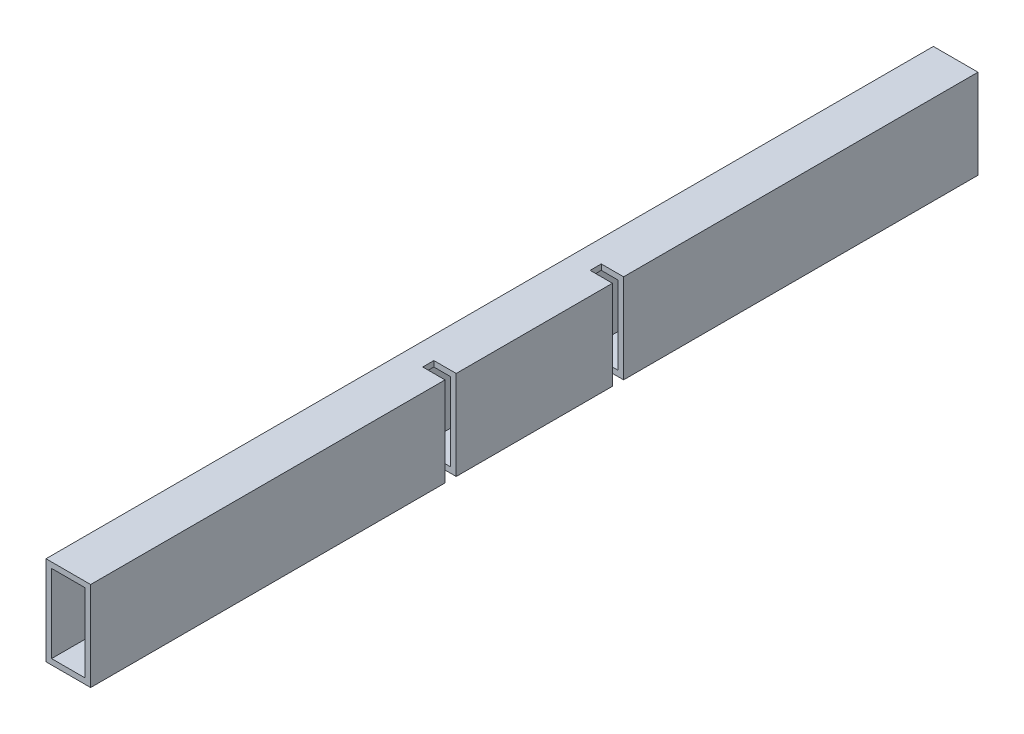
ISO-10303-21;
HEADER;
FILE_DESCRIPTION(('STEP AP214'),'2;1');
FILE_NAME('part.step','',(''),(''),'','','');
FILE_SCHEMA(('AUTOMOTIVE_DESIGN { 1 0 10303 214 1 1 1 1 }'));
ENDSEC;
DATA;
#1=APPLICATION_CONTEXT('core data for automotive mechanical design processes');
#2=APPLICATION_PROTOCOL_DEFINITION('international standard','automotive_design',2000,#1);
#3=PRODUCT_CONTEXT('',#1,'mechanical');
#4=PRODUCT('Part','Part','',(#3));
#5=PRODUCT_RELATED_PRODUCT_CATEGORY('part','',(#4));
#6=PRODUCT_DEFINITION_FORMATION('','',#4);
#7=PRODUCT_DEFINITION_CONTEXT('part definition',#1,'design');
#8=PRODUCT_DEFINITION('design','',#6,#7);
#9=PRODUCT_DEFINITION_SHAPE('','',#8);
#10=(LENGTH_UNIT() NAMED_UNIT(*) SI_UNIT(.MILLI.,.METRE.));
#11=(NAMED_UNIT(*) PLANE_ANGLE_UNIT() SI_UNIT($,.RADIAN.));
#12=(NAMED_UNIT(*) SI_UNIT($,.STERADIAN.) SOLID_ANGLE_UNIT());
#13=UNCERTAINTY_MEASURE_WITH_UNIT(LENGTH_MEASURE(1.E-05),#10,'distance_accuracy_value','');
#14=(GEOMETRIC_REPRESENTATION_CONTEXT(3) GLOBAL_UNCERTAINTY_ASSIGNED_CONTEXT((#13)) GLOBAL_UNIT_ASSIGNED_CONTEXT((#10,
#11,#12)) REPRESENTATION_CONTEXT('',''));
#15=CARTESIAN_POINT('',(0.,0.,0.));
#16=DIRECTION('',(0.,0.,1.));
#17=DIRECTION('',(1.,0.,0.));
#18=AXIS2_PLACEMENT_3D('',#15,#16,#17);
#19=CARTESIAN_POINT('',(12.7,25.4,252.476));
#20=DIRECTION('',(-1.,0.,0.));
#21=DIRECTION('',(0.,-1.,0.));
#22=AXIS2_PLACEMENT_3D('',#19,#20,#21);
#23=PLANE('',#22);
#24=DIRECTION('',(0.,0.,-1.));
#25=VECTOR('',#24,1.);
#26=CARTESIAN_POINT('',(12.7,-25.4,252.476));
#27=LINE('',#26,#25);
#28=CARTESIAN_POINT('',(12.7,-25.4,252.476));
#29=VERTEX_POINT('',#28);
#30=CARTESIAN_POINT('',(12.7,-25.4,50.8));
#31=VERTEX_POINT('',#30);
#32=EDGE_CURVE('E330',#29,#31,#27,.T.);
#33=ORIENTED_EDGE('',*,*,#32,.T.);
#34=DIRECTION('',(0.,-1.,0.));
#35=VECTOR('',#34,1.);
#36=CARTESIAN_POINT('',(12.7,-25.4,50.8));
#37=LINE('',#36,#35);
#38=CARTESIAN_POINT('',(12.7,25.4,50.8));
#39=VERTEX_POINT('',#38);
#40=EDGE_CURVE('E405',#39,#31,#37,.T.);
#41=ORIENTED_EDGE('',*,*,#40,.F.);
#42=DIRECTION('',(0.,0.,-1.));
#43=VECTOR('',#42,1.);
#44=CARTESIAN_POINT('',(12.7,25.4,252.476));
#45=LINE('',#44,#43);
#46=CARTESIAN_POINT('',(12.7,25.4,252.476));
#47=VERTEX_POINT('',#46);
#48=EDGE_CURVE('E340',#47,#39,#45,.T.);
#49=ORIENTED_EDGE('',*,*,#48,.F.);
#50=DIRECTION('',(0.,1.,0.));
#51=VECTOR('',#50,1.);
#52=CARTESIAN_POINT('',(12.7,25.4,252.476));
#53=LINE('',#52,#51);
#54=EDGE_CURVE('E311',#29,#47,#53,.T.);
#55=ORIENTED_EDGE('',*,*,#54,.F.);
#56=EDGE_LOOP('',(#33,#41,#49,#55));
#57=FACE_BOUND('',#56,.T.);
#58=ADVANCED_FACE('F33',(#57),#23,.F.);
#59=CARTESIAN_POINT('',(9.525,22.225,252.476));
#60=DIRECTION('',(-1.,0.,0.));
#61=DIRECTION('',(0.,-1.,0.));
#62=AXIS2_PLACEMENT_3D('',#59,#60,#61);
#63=PLANE('',#62);
#64=DIRECTION('',(0.,1.,0.));
#65=VECTOR('',#64,1.);
#66=CARTESIAN_POINT('',(9.525,22.2250000000001,50.8));
#67=LINE('',#66,#65);
#68=CARTESIAN_POINT('',(9.52500000000001,-22.225,50.7999999999999));
#69=VERTEX_POINT('',#68);
#70=CARTESIAN_POINT('',(9.525,22.225,50.8));
#71=VERTEX_POINT('',#70);
#72=EDGE_CURVE('E229',#69,#71,#67,.T.);
#73=ORIENTED_EDGE('',*,*,#72,.F.);
#74=DIRECTION('',(0.,0.,-1.));
#75=VECTOR('',#74,1.);
#76=CARTESIAN_POINT('',(9.52500000000001,-22.225,252.476));
#77=LINE('',#76,#75);
#78=CARTESIAN_POINT('',(9.52500000000001,-22.225,252.476));
#79=VERTEX_POINT('',#78);
#80=EDGE_CURVE('E303',#79,#69,#77,.T.);
#81=ORIENTED_EDGE('',*,*,#80,.F.);
#82=DIRECTION('',(0.,1.,0.));
#83=VECTOR('',#82,1.);
#84=CARTESIAN_POINT('',(9.525,22.225,252.476));
#85=LINE('',#84,#83);
#86=CARTESIAN_POINT('',(9.525,22.225,252.476));
#87=VERTEX_POINT('',#86);
#88=EDGE_CURVE('E279',#79,#87,#85,.T.);
#89=ORIENTED_EDGE('',*,*,#88,.T.);
#90=DIRECTION('',(0.,0.,-1.));
#91=VECTOR('',#90,1.);
#92=CARTESIAN_POINT('',(9.525,22.225,252.476));
#93=LINE('',#92,#91);
#94=EDGE_CURVE('E298',#87,#71,#93,.T.);
#95=ORIENTED_EDGE('',*,*,#94,.T.);
#96=EDGE_LOOP('',(#73,#81,#89,#95));
#97=FACE_BOUND('',#96,.T.);
#98=ADVANCED_FACE('F394',(#97),#63,.T.);
#99=CARTESIAN_POINT('',(12.7,25.4,-50.8));
#100=VERTEX_POINT('',#99);
#101=CARTESIAN_POINT('',(12.7,25.4,-252.476));
#102=VERTEX_POINT('',#101);
#103=EDGE_CURVE('E339',#100,#102,#45,.T.);
#104=ORIENTED_EDGE('',*,*,#103,.F.);
#105=DIRECTION('',(0.,1.,0.));
#106=VECTOR('',#105,1.);
#107=CARTESIAN_POINT('',(12.7,-25.4,-50.8));
#108=LINE('',#107,#106);
#109=CARTESIAN_POINT('',(12.7,-25.4,-50.8));
#110=VERTEX_POINT('',#109);
#111=EDGE_CURVE('E238',#110,#100,#108,.T.);
#112=ORIENTED_EDGE('',*,*,#111,.F.);
#113=CARTESIAN_POINT('',(12.7,-25.4,-252.476));
#114=VERTEX_POINT('',#113);
#115=EDGE_CURVE('E321',#110,#114,#27,.T.);
#116=ORIENTED_EDGE('',*,*,#115,.T.);
#117=DIRECTION('',(0.,1.,0.));
#118=VECTOR('',#117,1.);
#119=CARTESIAN_POINT('',(12.7,25.4,-252.476));
#120=LINE('',#119,#118);
#121=EDGE_CURVE('E310',#114,#102,#120,.T.);
#122=ORIENTED_EDGE('',*,*,#121,.T.);
#123=EDGE_LOOP('',(#104,#112,#116,#122));
#124=FACE_BOUND('',#123,.T.);
#125=ADVANCED_FACE('F426',(#124),#23,.F.);
#126=DIRECTION('',(0.,-1.,0.));
#127=VECTOR('',#126,1.);
#128=CARTESIAN_POINT('',(9.525,22.225,-50.8));
#129=LINE('',#128,#127);
#130=CARTESIAN_POINT('',(9.525,22.225,-50.8));
#131=VERTEX_POINT('',#130);
#132=CARTESIAN_POINT('',(9.52500000000001,-22.225,-50.8));
#133=VERTEX_POINT('',#132);
#134=EDGE_CURVE('E269',#131,#133,#129,.T.);
#135=ORIENTED_EDGE('',*,*,#134,.F.);
#136=CARTESIAN_POINT('',(9.525,22.225,-252.476));
#137=VERTEX_POINT('',#136);
#138=EDGE_CURVE('E297',#131,#137,#93,.T.);
#139=ORIENTED_EDGE('',*,*,#138,.T.);
#140=DIRECTION('',(0.,1.,0.));
#141=VECTOR('',#140,1.);
#142=CARTESIAN_POINT('',(9.525,22.225,-252.476));
#143=LINE('',#142,#141);
#144=CARTESIAN_POINT('',(9.52500000000001,-22.225,-252.476));
#145=VERTEX_POINT('',#144);
#146=EDGE_CURVE('E290',#145,#137,#143,.T.);
#147=ORIENTED_EDGE('',*,*,#146,.F.);
#148=EDGE_CURVE('E301',#133,#145,#77,.T.);
#149=ORIENTED_EDGE('',*,*,#148,.F.);
#150=EDGE_LOOP('',(#135,#139,#147,#149));
#151=FACE_BOUND('',#150,.T.);
#152=ADVANCED_FACE('F372',(#151),#63,.T.);
#153=CARTESIAN_POINT('',(0.,0.,252.476));
#154=DIRECTION('',(0.,0.,1.));
#155=DIRECTION('',(1.,0.,0.));
#156=AXIS2_PLACEMENT_3D('',#153,#154,#155);
#157=PLANE('',#156);
#158=ORIENTED_EDGE('',*,*,#54,.T.);
#159=DIRECTION('',(-1.,0.,0.));
#160=VECTOR('',#159,1.);
#161=CARTESIAN_POINT('',(-12.7,25.4,252.476));
#162=LINE('',#161,#160);
#163=CARTESIAN_POINT('',(-12.7,25.4,252.476));
#164=VERTEX_POINT('',#163);
#165=EDGE_CURVE('E314',#47,#164,#162,.T.);
#166=ORIENTED_EDGE('',*,*,#165,.T.);
#167=DIRECTION('',(0.,-1.,0.));
#168=VECTOR('',#167,1.);
#169=CARTESIAN_POINT('',(-12.7,25.4,252.476));
#170=LINE('',#169,#168);
#171=CARTESIAN_POINT('',(-12.7,-25.4,252.476));
#172=VERTEX_POINT('',#171);
#173=EDGE_CURVE('E317',#164,#172,#170,.T.);
#174=ORIENTED_EDGE('',*,*,#173,.T.);
#175=DIRECTION('',(1.,0.,0.));
#176=VECTOR('',#175,1.);
#177=CARTESIAN_POINT('',(-12.7,-25.4,252.476));
#178=LINE('',#177,#176);
#179=EDGE_CURVE('E319',#172,#29,#178,.T.);
#180=ORIENTED_EDGE('',*,*,#179,.T.);
#181=EDGE_LOOP('',(#158,#166,#174,#180));
#182=FACE_BOUND('',#181,.T.);
#183=DIRECTION('',(1.,0.,0.));
#184=VECTOR('',#183,1.);
#185=CARTESIAN_POINT('',(-9.525,-22.225,252.476));
#186=LINE('',#185,#184);
#187=CARTESIAN_POINT('',(-9.525,-22.225,252.476));
#188=VERTEX_POINT('',#187);
#189=EDGE_CURVE('E276',#188,#79,#186,.T.);
#190=ORIENTED_EDGE('',*,*,#189,.F.);
#191=DIRECTION('',(0.,-1.,0.));
#192=VECTOR('',#191,1.);
#193=CARTESIAN_POINT('',(-9.525,22.225,252.476));
#194=LINE('',#193,#192);
#195=CARTESIAN_POINT('',(-9.525,22.225,252.476));
#196=VERTEX_POINT('',#195);
#197=EDGE_CURVE('E274',#196,#188,#194,.T.);
#198=ORIENTED_EDGE('',*,*,#197,.F.);
#199=DIRECTION('',(-1.,0.,0.));
#200=VECTOR('',#199,1.);
#201=CARTESIAN_POINT('',(-9.525,22.225,252.476));
#202=LINE('',#201,#200);
#203=EDGE_CURVE('E282',#87,#196,#202,.T.);
#204=ORIENTED_EDGE('',*,*,#203,.F.);
#205=ORIENTED_EDGE('',*,*,#88,.F.);
#206=EDGE_LOOP('',(#190,#198,#204,#205));
#207=FACE_BOUND('',#206,.T.);
#208=ADVANCED_FACE('F389',(#182,#207),#157,.T.);
#209=CARTESIAN_POINT('',(0.,0.,-252.476));
#210=DIRECTION('',(0.,0.,1.));
#211=DIRECTION('',(1.,0.,0.));
#212=AXIS2_PLACEMENT_3D('',#209,#210,#211);
#213=PLANE('',#212);
#214=ORIENTED_EDGE('',*,*,#121,.F.);
#215=DIRECTION('',(1.,0.,0.));
#216=VECTOR('',#215,1.);
#217=CARTESIAN_POINT('',(-12.7,-25.4,-252.476));
#218=LINE('',#217,#216);
#219=CARTESIAN_POINT('',(-12.7,-25.4,-252.476));
#220=VERTEX_POINT('',#219);
#221=EDGE_CURVE('E315',#220,#114,#218,.T.);
#222=ORIENTED_EDGE('',*,*,#221,.F.);
#223=DIRECTION('',(0.,-1.,0.));
#224=VECTOR('',#223,1.);
#225=CARTESIAN_POINT('',(-12.7,25.4,-252.476));
#226=LINE('',#225,#224);
#227=CARTESIAN_POINT('',(-12.7,25.4,-252.476));
#228=VERTEX_POINT('',#227);
#229=EDGE_CURVE('E326',#228,#220,#226,.T.);
#230=ORIENTED_EDGE('',*,*,#229,.F.);
#231=DIRECTION('',(-1.,0.,0.));
#232=VECTOR('',#231,1.);
#233=CARTESIAN_POINT('',(-12.7,25.4,-252.476));
#234=LINE('',#233,#232);
#235=EDGE_CURVE('E324',#102,#228,#234,.T.);
#236=ORIENTED_EDGE('',*,*,#235,.F.);
#237=EDGE_LOOP('',(#214,#222,#230,#236));
#238=FACE_BOUND('',#237,.T.);
#239=DIRECTION('',(0.,-1.,0.));
#240=VECTOR('',#239,1.);
#241=CARTESIAN_POINT('',(-9.525,22.225,-252.476));
#242=LINE('',#241,#240);
#243=CARTESIAN_POINT('',(-9.525,22.225,-252.476));
#244=VERTEX_POINT('',#243);
#245=CARTESIAN_POINT('',(-9.525,-22.225,-252.476));
#246=VERTEX_POINT('',#245);
#247=EDGE_CURVE('E273',#244,#246,#242,.T.);
#248=ORIENTED_EDGE('',*,*,#247,.T.);
#249=DIRECTION('',(1.,0.,0.));
#250=VECTOR('',#249,1.);
#251=CARTESIAN_POINT('',(-9.525,-22.225,-252.476));
#252=LINE('',#251,#250);
#253=EDGE_CURVE('E287',#246,#145,#252,.T.);
#254=ORIENTED_EDGE('',*,*,#253,.T.);
#255=ORIENTED_EDGE('',*,*,#146,.T.);
#256=DIRECTION('',(-1.,0.,0.));
#257=VECTOR('',#256,1.);
#258=CARTESIAN_POINT('',(-9.525,22.225,-252.476));
#259=LINE('',#258,#257);
#260=EDGE_CURVE('E277',#137,#244,#259,.T.);
#261=ORIENTED_EDGE('',*,*,#260,.T.);
#262=EDGE_LOOP('',(#248,#254,#255,#261));
#263=FACE_BOUND('',#262,.T.);
#264=ADVANCED_FACE('F377',(#238,#263),#213,.F.);
#265=CARTESIAN_POINT('',(12.7,25.4,44.45));
#266=VERTEX_POINT('',#265);
#267=CARTESIAN_POINT('',(12.7,25.4,-44.45));
#268=VERTEX_POINT('',#267);
#269=EDGE_CURVE('E344',#266,#268,#45,.T.);
#270=ORIENTED_EDGE('',*,*,#269,.F.);
#271=DIRECTION('',(0.,1.,0.));
#272=VECTOR('',#271,1.);
#273=CARTESIAN_POINT('',(12.7,25.4,44.45));
#274=LINE('',#273,#272);
#275=CARTESIAN_POINT('',(12.7,-25.4,44.45));
#276=VERTEX_POINT('',#275);
#277=EDGE_CURVE('E399',#276,#266,#274,.T.);
#278=ORIENTED_EDGE('',*,*,#277,.F.);
#279=CARTESIAN_POINT('',(12.7,-25.4,-44.45));
#280=VERTEX_POINT('',#279);
#281=EDGE_CURVE('E215',#276,#280,#27,.T.);
#282=ORIENTED_EDGE('',*,*,#281,.T.);
#283=DIRECTION('',(0.,-1.,0.));
#284=VECTOR('',#283,1.);
#285=CARTESIAN_POINT('',(12.7,25.4,-44.45));
#286=LINE('',#285,#284);
#287=EDGE_CURVE('E233',#268,#280,#286,.T.);
#288=ORIENTED_EDGE('',*,*,#287,.F.);
#289=EDGE_LOOP('',(#270,#278,#282,#288));
#290=FACE_BOUND('',#289,.T.);
#291=ADVANCED_FACE('F35',(#290),#23,.F.);
#292=CARTESIAN_POINT('',(-12.7,25.4,252.476));
#293=DIRECTION('',(0.,-1.,0.));
#294=DIRECTION('',(0.,0.,-1.));
#295=AXIS2_PLACEMENT_3D('',#292,#293,#294);
#296=PLANE('',#295);
#297=ORIENTED_EDGE('',*,*,#48,.T.);
#298=DIRECTION('',(1.,0.,0.));
#299=VECTOR('',#298,1.);
#300=CARTESIAN_POINT('',(0.,25.4,50.8));
#301=LINE('',#300,#299);
#302=CARTESIAN_POINT('',(0.,25.4,50.8));
#303=VERTEX_POINT('',#302);
#304=EDGE_CURVE('E219',#303,#39,#301,.T.);
#305=ORIENTED_EDGE('',*,*,#304,.F.);
#306=DIRECTION('',(0.,0.,1.));
#307=VECTOR('',#306,1.);
#308=CARTESIAN_POINT('',(0.,25.4,50.8));
#309=LINE('',#308,#307);
#310=CARTESIAN_POINT('',(0.,25.4,44.45));
#311=VERTEX_POINT('',#310);
#312=EDGE_CURVE('E203',#311,#303,#309,.T.);
#313=ORIENTED_EDGE('',*,*,#312,.F.);
#314=DIRECTION('',(1.,0.,0.));
#315=VECTOR('',#314,1.);
#316=CARTESIAN_POINT('',(0.,25.4,44.45));
#317=LINE('',#316,#315);
#318=EDGE_CURVE('E216',#311,#266,#317,.T.);
#319=ORIENTED_EDGE('',*,*,#318,.T.);
#320=ORIENTED_EDGE('',*,*,#269,.T.);
#321=DIRECTION('',(1.,0.,0.));
#322=VECTOR('',#321,1.);
#323=CARTESIAN_POINT('',(0.,25.4,-44.45));
#324=LINE('',#323,#322);
#325=CARTESIAN_POINT('',(0.,25.4,-44.45));
#326=VERTEX_POINT('',#325);
#327=EDGE_CURVE('E247',#326,#268,#324,.T.);
#328=ORIENTED_EDGE('',*,*,#327,.F.);
#329=DIRECTION('',(0.,0.,1.));
#330=VECTOR('',#329,1.);
#331=CARTESIAN_POINT('',(0.,25.4,-50.8));
#332=LINE('',#331,#330);
#333=CARTESIAN_POINT('',(0.,25.4,-50.8));
#334=VERTEX_POINT('',#333);
#335=EDGE_CURVE('E234',#334,#326,#332,.T.);
#336=ORIENTED_EDGE('',*,*,#335,.F.);
#337=DIRECTION('',(1.,0.,0.));
#338=VECTOR('',#337,1.);
#339=CARTESIAN_POINT('',(0.,25.4,-50.8));
#340=LINE('',#339,#338);
#341=EDGE_CURVE('E251',#334,#100,#340,.T.);
#342=ORIENTED_EDGE('',*,*,#341,.T.);
#343=ORIENTED_EDGE('',*,*,#103,.T.);
#344=ORIENTED_EDGE('',*,*,#235,.T.);
#345=DIRECTION('',(0.,0.,-1.));
#346=VECTOR('',#345,1.);
#347=CARTESIAN_POINT('',(-12.7,25.4,252.476));
#348=LINE('',#347,#346);
#349=EDGE_CURVE('E336',#164,#228,#348,.T.);
#350=ORIENTED_EDGE('',*,*,#349,.F.);
#351=ORIENTED_EDGE('',*,*,#165,.F.);
#352=EDGE_LOOP('',(#297,#305,#313,#319,#320,#328,#336,#342,#343,#344,#350,#351));
#353=FACE_BOUND('',#352,.T.);
#354=ADVANCED_FACE('F402',(#353),#296,.F.);
#355=CARTESIAN_POINT('',(-12.7,25.4,252.476));
#356=DIRECTION('',(1.,0.,0.));
#357=DIRECTION('',(0.,1.,0.));
#358=AXIS2_PLACEMENT_3D('',#355,#356,#357);
#359=PLANE('',#358);
#360=ORIENTED_EDGE('',*,*,#229,.T.);
#361=DIRECTION('',(0.,0.,-1.));
#362=VECTOR('',#361,1.);
#363=CARTESIAN_POINT('',(-12.7,-25.4,252.476));
#364=LINE('',#363,#362);
#365=EDGE_CURVE('E333',#172,#220,#364,.T.);
#366=ORIENTED_EDGE('',*,*,#365,.F.);
#367=ORIENTED_EDGE('',*,*,#173,.F.);
#368=ORIENTED_EDGE('',*,*,#349,.T.);
#369=EDGE_LOOP('',(#360,#366,#367,#368));
#370=FACE_BOUND('',#369,.T.);
#371=ADVANCED_FACE('F448',(#370),#359,.F.);
#372=CARTESIAN_POINT('',(-12.7,-25.4,252.476));
#373=DIRECTION('',(0.,1.,0.));
#374=DIRECTION('',(0.,0.,1.));
#375=AXIS2_PLACEMENT_3D('',#372,#373,#374);
#376=PLANE('',#375);
#377=DIRECTION('',(0.,0.,-1.));
#378=VECTOR('',#377,1.);
#379=CARTESIAN_POINT('',(0.,-25.4,44.45));
#380=LINE('',#379,#378);
#381=CARTESIAN_POINT('',(0.,-25.4,50.8));
#382=VERTEX_POINT('',#381);
#383=CARTESIAN_POINT('',(0.,-25.4,44.45));
#384=VERTEX_POINT('',#383);
#385=EDGE_CURVE('E207',#382,#384,#380,.T.);
#386=ORIENTED_EDGE('',*,*,#385,.F.);
#387=DIRECTION('',(1.,0.,0.));
#388=VECTOR('',#387,1.);
#389=CARTESIAN_POINT('',(0.,-25.4,50.8));
#390=LINE('',#389,#388);
#391=EDGE_CURVE('E48',#382,#31,#390,.T.);
#392=ORIENTED_EDGE('',*,*,#391,.T.);
#393=ORIENTED_EDGE('',*,*,#32,.F.);
#394=ORIENTED_EDGE('',*,*,#179,.F.);
#395=ORIENTED_EDGE('',*,*,#365,.T.);
#396=ORIENTED_EDGE('',*,*,#221,.T.);
#397=ORIENTED_EDGE('',*,*,#115,.F.);
#398=DIRECTION('',(1.,0.,0.));
#399=VECTOR('',#398,1.);
#400=CARTESIAN_POINT('',(0.,-25.4,-50.8));
#401=LINE('',#400,#399);
#402=CARTESIAN_POINT('',(0.,-25.4,-50.8));
#403=VERTEX_POINT('',#402);
#404=EDGE_CURVE('E255',#403,#110,#401,.T.);
#405=ORIENTED_EDGE('',*,*,#404,.F.);
#406=DIRECTION('',(0.,0.,-1.));
#407=VECTOR('',#406,1.);
#408=CARTESIAN_POINT('',(0.,-25.4,-44.45));
#409=LINE('',#408,#407);
#410=CARTESIAN_POINT('',(0.,-25.4,-44.4499999999999));
#411=VERTEX_POINT('',#410);
#412=EDGE_CURVE('E241',#411,#403,#409,.T.);
#413=ORIENTED_EDGE('',*,*,#412,.F.);
#414=DIRECTION('',(1.,0.,0.));
#415=VECTOR('',#414,1.);
#416=CARTESIAN_POINT('',(0.,-25.4,-44.45));
#417=LINE('',#416,#415);
#418=EDGE_CURVE('E257',#411,#280,#417,.T.);
#419=ORIENTED_EDGE('',*,*,#418,.T.);
#420=ORIENTED_EDGE('',*,*,#281,.F.);
#421=DIRECTION('',(1.,0.,0.));
#422=VECTOR('',#421,1.);
#423=CARTESIAN_POINT('',(0.,-25.4,44.45));
#424=LINE('',#423,#422);
#425=EDGE_CURVE('E197',#384,#276,#424,.T.);
#426=ORIENTED_EDGE('',*,*,#425,.F.);
#427=EDGE_LOOP('',(#386,#392,#393,#394,#395,#396,#397,#405,#413,#419,#420,#426));
#428=FACE_BOUND('',#427,.T.);
#429=ADVANCED_FACE('F213',(#428),#376,.F.);
#430=CARTESIAN_POINT('',(-9.525,22.225,252.476));
#431=DIRECTION('',(1.,0.,0.));
#432=DIRECTION('',(0.,1.,0.));
#433=AXIS2_PLACEMENT_3D('',#430,#431,#432);
#434=PLANE('',#433);
#435=ORIENTED_EDGE('',*,*,#247,.F.);
#436=DIRECTION('',(0.,0.,-1.));
#437=VECTOR('',#436,1.);
#438=CARTESIAN_POINT('',(-9.525,22.225,252.476));
#439=LINE('',#438,#437);
#440=EDGE_CURVE('E284',#196,#244,#439,.T.);
#441=ORIENTED_EDGE('',*,*,#440,.F.);
#442=ORIENTED_EDGE('',*,*,#197,.T.);
#443=DIRECTION('',(0.,0.,-1.));
#444=VECTOR('',#443,1.);
#445=CARTESIAN_POINT('',(-9.525,-22.225,252.476));
#446=LINE('',#445,#444);
#447=EDGE_CURVE('E306',#188,#246,#446,.T.);
#448=ORIENTED_EDGE('',*,*,#447,.T.);
#449=EDGE_LOOP('',(#435,#441,#442,#448));
#450=FACE_BOUND('',#449,.T.);
#451=ADVANCED_FACE('F385',(#450),#434,.T.);
#452=CARTESIAN_POINT('',(-9.525,-22.225,252.476));
#453=DIRECTION('',(0.,1.,0.));
#454=DIRECTION('',(-1.,0.,0.));
#455=AXIS2_PLACEMENT_3D('',#452,#453,#454);
#456=PLANE('',#455);
#457=DIRECTION('',(1.,0.,0.));
#458=VECTOR('',#457,1.);
#459=CARTESIAN_POINT('',(-9.525,-22.225,50.8));
#460=LINE('',#459,#458);
#461=CARTESIAN_POINT('',(0.,-22.225,50.8));
#462=VERTEX_POINT('',#461);
#463=EDGE_CURVE('E231',#462,#69,#460,.T.);
#464=ORIENTED_EDGE('',*,*,#463,.F.);
#465=DIRECTION('',(0.,0.,1.));
#466=VECTOR('',#465,1.);
#467=CARTESIAN_POINT('',(0.,-22.225,252.476));
#468=LINE('',#467,#466);
#469=CARTESIAN_POINT('',(0.,-22.225,44.45));
#470=VERTEX_POINT('',#469);
#471=EDGE_CURVE('E224',#470,#462,#468,.T.);
#472=ORIENTED_EDGE('',*,*,#471,.F.);
#473=DIRECTION('',(-1.,0.,0.));
#474=VECTOR('',#473,1.);
#475=CARTESIAN_POINT('',(-9.525,-22.225,44.45));
#476=LINE('',#475,#474);
#477=CARTESIAN_POINT('',(9.52500000000001,-22.225,44.45));
#478=VERTEX_POINT('',#477);
#479=EDGE_CURVE('E200',#478,#470,#476,.T.);
#480=ORIENTED_EDGE('',*,*,#479,.F.);
#481=CARTESIAN_POINT('',(9.52500000000001,-22.225,-44.45));
#482=VERTEX_POINT('',#481);
#483=EDGE_CURVE('E307',#478,#482,#77,.T.);
#484=ORIENTED_EDGE('',*,*,#483,.T.);
#485=DIRECTION('',(1.,0.,0.));
#486=VECTOR('',#485,1.);
#487=CARTESIAN_POINT('',(-9.525,-22.225,-44.45));
#488=LINE('',#487,#486);
#489=CARTESIAN_POINT('',(0.,-22.225,-44.45));
#490=VERTEX_POINT('',#489);
#491=EDGE_CURVE('E266',#490,#482,#488,.T.);
#492=ORIENTED_EDGE('',*,*,#491,.F.);
#493=DIRECTION('',(0.,0.,-1.));
#494=VECTOR('',#493,1.);
#495=CARTESIAN_POINT('',(0.,-22.225,252.476));
#496=LINE('',#495,#494);
#497=CARTESIAN_POINT('',(0.,-22.225,-50.8));
#498=VERTEX_POINT('',#497);
#499=EDGE_CURVE('E254',#490,#498,#496,.T.);
#500=ORIENTED_EDGE('',*,*,#499,.T.);
#501=DIRECTION('',(-1.,0.,0.));
#502=VECTOR('',#501,1.);
#503=CARTESIAN_POINT('',(-9.525,-22.225,-50.8));
#504=LINE('',#503,#502);
#505=EDGE_CURVE('E271',#133,#498,#504,.T.);
#506=ORIENTED_EDGE('',*,*,#505,.F.);
#507=ORIENTED_EDGE('',*,*,#148,.T.);
#508=ORIENTED_EDGE('',*,*,#253,.F.);
#509=ORIENTED_EDGE('',*,*,#447,.F.);
#510=ORIENTED_EDGE('',*,*,#189,.T.);
#511=ORIENTED_EDGE('',*,*,#80,.T.);
#512=EDGE_LOOP('',(#464,#472,#480,#484,#492,#500,#506,#507,#508,#509,#510,#511));
#513=FACE_BOUND('',#512,.T.);
#514=ADVANCED_FACE('F381',(#513),#456,.T.);
#515=DIRECTION('',(0.,-1.,0.));
#516=VECTOR('',#515,1.);
#517=CARTESIAN_POINT('',(9.525,22.225,44.45));
#518=LINE('',#517,#516);
#519=CARTESIAN_POINT('',(9.525,22.225,44.45));
#520=VERTEX_POINT('',#519);
#521=EDGE_CURVE('E226',#520,#478,#518,.T.);
#522=ORIENTED_EDGE('',*,*,#521,.F.);
#523=CARTESIAN_POINT('',(9.525,22.225,-44.45));
#524=VERTEX_POINT('',#523);
#525=EDGE_CURVE('E302',#520,#524,#93,.T.);
#526=ORIENTED_EDGE('',*,*,#525,.T.);
#527=DIRECTION('',(0.,1.,0.));
#528=VECTOR('',#527,1.);
#529=CARTESIAN_POINT('',(9.525,22.2250000000001,-44.45));
#530=LINE('',#529,#528);
#531=EDGE_CURVE('E263',#482,#524,#530,.T.);
#532=ORIENTED_EDGE('',*,*,#531,.F.);
#533=ORIENTED_EDGE('',*,*,#483,.F.);
#534=EDGE_LOOP('',(#522,#526,#532,#533));
#535=FACE_BOUND('',#534,.T.);
#536=ADVANCED_FACE('F362',(#535),#63,.T.);
#537=CARTESIAN_POINT('',(-9.525,22.225,252.476));
#538=DIRECTION('',(0.,-1.,0.));
#539=DIRECTION('',(0.,0.,-1.));
#540=AXIS2_PLACEMENT_3D('',#537,#538,#539);
#541=PLANE('',#540);
#542=DIRECTION('',(-1.,0.,0.));
#543=VECTOR('',#542,1.);
#544=CARTESIAN_POINT('',(-9.525,22.225,50.8));
#545=LINE('',#544,#543);
#546=CARTESIAN_POINT('',(0.,22.225,50.8));
#547=VERTEX_POINT('',#546);
#548=EDGE_CURVE('E11',#71,#547,#545,.T.);
#549=ORIENTED_EDGE('',*,*,#548,.F.);
#550=ORIENTED_EDGE('',*,*,#94,.F.);
#551=ORIENTED_EDGE('',*,*,#203,.T.);
#552=ORIENTED_EDGE('',*,*,#440,.T.);
#553=ORIENTED_EDGE('',*,*,#260,.F.);
#554=ORIENTED_EDGE('',*,*,#138,.F.);
#555=DIRECTION('',(1.,0.,0.));
#556=VECTOR('',#555,1.);
#557=CARTESIAN_POINT('',(-9.525,22.225,-50.8));
#558=LINE('',#557,#556);
#559=CARTESIAN_POINT('',(0.,22.225,-50.8));
#560=VERTEX_POINT('',#559);
#561=EDGE_CURVE('E350',#560,#131,#558,.T.);
#562=ORIENTED_EDGE('',*,*,#561,.F.);
#563=DIRECTION('',(0.,0.,1.));
#564=VECTOR('',#563,1.);
#565=CARTESIAN_POINT('',(0.,22.225,252.476));
#566=LINE('',#565,#564);
#567=CARTESIAN_POINT('',(0.,22.225,-44.4499999999999));
#568=VERTEX_POINT('',#567);
#569=EDGE_CURVE('E343',#560,#568,#566,.T.);
#570=ORIENTED_EDGE('',*,*,#569,.T.);
#571=DIRECTION('',(-1.,0.,0.));
#572=VECTOR('',#571,1.);
#573=CARTESIAN_POINT('',(-9.525,22.225,-44.45));
#574=LINE('',#573,#572);
#575=EDGE_CURVE('E347',#524,#568,#574,.T.);
#576=ORIENTED_EDGE('',*,*,#575,.F.);
#577=ORIENTED_EDGE('',*,*,#525,.F.);
#578=DIRECTION('',(1.,0.,0.));
#579=VECTOR('',#578,1.);
#580=CARTESIAN_POINT('',(-9.525,22.225,44.45));
#581=LINE('',#580,#579);
#582=CARTESIAN_POINT('',(0.,22.225,44.45));
#583=VERTEX_POINT('',#582);
#584=EDGE_CURVE('E41',#583,#520,#581,.T.);
#585=ORIENTED_EDGE('',*,*,#584,.F.);
#586=DIRECTION('',(0.,0.,-1.));
#587=VECTOR('',#586,1.);
#588=CARTESIAN_POINT('',(0.,22.225,252.476));
#589=LINE('',#588,#587);
#590=EDGE_CURVE('E352',#547,#583,#589,.T.);
#591=ORIENTED_EDGE('',*,*,#590,.F.);
#592=EDGE_LOOP('',(#549,#550,#551,#552,#553,#554,#562,#570,#576,#577,#585,#591));
#593=FACE_BOUND('',#592,.T.);
#594=ADVANCED_FACE('F366',(#593),#541,.T.);
#595=CARTESIAN_POINT('',(0.,0.,0.));
#596=DIRECTION('',(1.,0.,0.));
#597=DIRECTION('',(0.,1.,0.));
#598=AXIS2_PLACEMENT_3D('',#595,#596,#597);
#599=PLANE('',#598);
#600=DIRECTION('',(0.,-1.,0.));
#601=VECTOR('',#600,1.);
#602=CARTESIAN_POINT('',(0.,25.4,-44.45));
#603=LINE('',#602,#601);
#604=EDGE_CURVE('E237',#490,#411,#603,.T.);
#605=ORIENTED_EDGE('',*,*,#604,.T.);
#606=ORIENTED_EDGE('',*,*,#412,.T.);
#607=DIRECTION('',(0.,1.,0.));
#608=VECTOR('',#607,1.);
#609=CARTESIAN_POINT('',(0.,-25.4,-50.8));
#610=LINE('',#609,#608);
#611=EDGE_CURVE('E244',#403,#498,#610,.T.);
#612=ORIENTED_EDGE('',*,*,#611,.T.);
#613=ORIENTED_EDGE('',*,*,#499,.F.);
#614=EDGE_LOOP('',(#605,#606,#612,#613));
#615=FACE_BOUND('',#614,.T.);
#616=ADVANCED_FACE('F439',(#615),#599,.T.);
#617=CARTESIAN_POINT('',(0.,-25.4,-50.8));
#618=DIRECTION('',(0.,0.,-1.));
#619=DIRECTION('',(-1.,0.,0.));
#620=AXIS2_PLACEMENT_3D('',#617,#618,#619);
#621=PLANE('',#620);
#622=ORIENTED_EDGE('',*,*,#505,.T.);
#623=ORIENTED_EDGE('',*,*,#611,.F.);
#624=ORIENTED_EDGE('',*,*,#404,.T.);
#625=ORIENTED_EDGE('',*,*,#111,.T.);
#626=ORIENTED_EDGE('',*,*,#341,.F.);
#627=EDGE_CURVE('E243',#560,#334,#610,.T.);
#628=ORIENTED_EDGE('',*,*,#627,.F.);
#629=ORIENTED_EDGE('',*,*,#561,.T.);
#630=ORIENTED_EDGE('',*,*,#134,.T.);
#631=EDGE_LOOP('',(#622,#623,#624,#625,#626,#628,#629,#630));
#632=FACE_BOUND('',#631,.T.);
#633=ADVANCED_FACE('F441',(#632),#621,.F.);
#634=CARTESIAN_POINT('',(0.,25.4,-44.45));
#635=DIRECTION('',(0.,0.,1.));
#636=DIRECTION('',(0.,-1.,0.));
#637=AXIS2_PLACEMENT_3D('',#634,#635,#636);
#638=PLANE('',#637);
#639=ORIENTED_EDGE('',*,*,#491,.T.);
#640=ORIENTED_EDGE('',*,*,#531,.T.);
#641=ORIENTED_EDGE('',*,*,#575,.T.);
#642=EDGE_CURVE('E239',#326,#568,#603,.T.);
#643=ORIENTED_EDGE('',*,*,#642,.F.);
#644=ORIENTED_EDGE('',*,*,#327,.T.);
#645=ORIENTED_EDGE('',*,*,#287,.T.);
#646=ORIENTED_EDGE('',*,*,#418,.F.);
#647=ORIENTED_EDGE('',*,*,#604,.F.);
#648=EDGE_LOOP('',(#639,#640,#641,#643,#644,#645,#646,#647));
#649=FACE_BOUND('',#648,.T.);
#650=ADVANCED_FACE('F432',(#649),#638,.F.);
#651=ORIENTED_EDGE('',*,*,#627,.T.);
#652=ORIENTED_EDGE('',*,*,#335,.T.);
#653=ORIENTED_EDGE('',*,*,#642,.T.);
#654=ORIENTED_EDGE('',*,*,#569,.F.);
#655=EDGE_LOOP('',(#651,#652,#653,#654));
#656=FACE_BOUND('',#655,.T.);
#657=ADVANCED_FACE('F445',(#656),#599,.T.);
#658=CARTESIAN_POINT('',(0.,0.,0.));
#659=DIRECTION('',(-1.,0.,0.));
#660=DIRECTION('',(0.,-1.,0.));
#661=AXIS2_PLACEMENT_3D('',#658,#659,#660);
#662=PLANE('',#661);
#663=ORIENTED_EDGE('',*,*,#471,.T.);
#664=DIRECTION('',(0.,-1.,0.));
#665=VECTOR('',#664,1.);
#666=CARTESIAN_POINT('',(0.,-25.4,50.8));
#667=LINE('',#666,#665);
#668=EDGE_CURVE('E209',#462,#382,#667,.T.);
#669=ORIENTED_EDGE('',*,*,#668,.T.);
#670=ORIENTED_EDGE('',*,*,#385,.T.);
#671=DIRECTION('',(0.,1.,0.));
#672=VECTOR('',#671,1.);
#673=CARTESIAN_POINT('',(0.,25.4,44.45));
#674=LINE('',#673,#672);
#675=EDGE_CURVE('E193',#384,#470,#674,.T.);
#676=ORIENTED_EDGE('',*,*,#675,.T.);
#677=EDGE_LOOP('',(#663,#669,#670,#676));
#678=FACE_BOUND('',#677,.T.);
#679=ADVANCED_FACE('F208',(#678),#662,.F.);
#680=CARTESIAN_POINT('',(0.,-25.4,50.8));
#681=DIRECTION('',(0.,0.,1.));
#682=DIRECTION('',(0.,-1.,0.));
#683=AXIS2_PLACEMENT_3D('',#680,#681,#682);
#684=PLANE('',#683);
#685=ORIENTED_EDGE('',*,*,#463,.T.);
#686=ORIENTED_EDGE('',*,*,#72,.T.);
#687=ORIENTED_EDGE('',*,*,#548,.T.);
#688=EDGE_CURVE('E56',#303,#547,#667,.T.);
#689=ORIENTED_EDGE('',*,*,#688,.F.);
#690=ORIENTED_EDGE('',*,*,#304,.T.);
#691=ORIENTED_EDGE('',*,*,#40,.T.);
#692=ORIENTED_EDGE('',*,*,#391,.F.);
#693=ORIENTED_EDGE('',*,*,#668,.F.);
#694=EDGE_LOOP('',(#685,#686,#687,#689,#690,#691,#692,#693));
#695=FACE_BOUND('',#694,.T.);
#696=ADVANCED_FACE('F395',(#695),#684,.F.);
#697=CARTESIAN_POINT('',(0.,25.4,44.45));
#698=DIRECTION('',(0.,0.,-1.));
#699=DIRECTION('',(-1.,0.,0.));
#700=AXIS2_PLACEMENT_3D('',#697,#698,#699);
#701=PLANE('',#700);
#702=ORIENTED_EDGE('',*,*,#479,.T.);
#703=ORIENTED_EDGE('',*,*,#675,.F.);
#704=ORIENTED_EDGE('',*,*,#425,.T.);
#705=ORIENTED_EDGE('',*,*,#277,.T.);
#706=ORIENTED_EDGE('',*,*,#318,.F.);
#707=EDGE_CURVE('E204',#583,#311,#674,.T.);
#708=ORIENTED_EDGE('',*,*,#707,.F.);
#709=ORIENTED_EDGE('',*,*,#584,.T.);
#710=ORIENTED_EDGE('',*,*,#521,.T.);
#711=EDGE_LOOP('',(#702,#703,#704,#705,#706,#708,#709,#710));
#712=FACE_BOUND('',#711,.T.);
#713=ADVANCED_FACE('F195',(#712),#701,.F.);
#714=ORIENTED_EDGE('',*,*,#590,.T.);
#715=ORIENTED_EDGE('',*,*,#707,.T.);
#716=ORIENTED_EDGE('',*,*,#312,.T.);
#717=ORIENTED_EDGE('',*,*,#688,.T.);
#718=EDGE_LOOP('',(#714,#715,#716,#717));
#719=FACE_BOUND('',#718,.T.);
#720=ADVANCED_FACE('F396',(#719),#662,.F.);
#721=CLOSED_SHELL('',(#58,#98,#125,#152,#208,#264,#291,#354,#371,#429,#451,#514,#536,#594,#616,
#633,#650,#657,#679,#696,#713,#720));
#722=MANIFOLD_SOLID_BREP('B2',#721);
#723=ADVANCED_BREP_SHAPE_REPRESENTATION('',(#18,#722),#14);
#724=SHAPE_DEFINITION_REPRESENTATION(#9,#723);
ENDSEC;
END-ISO-10303-21;
